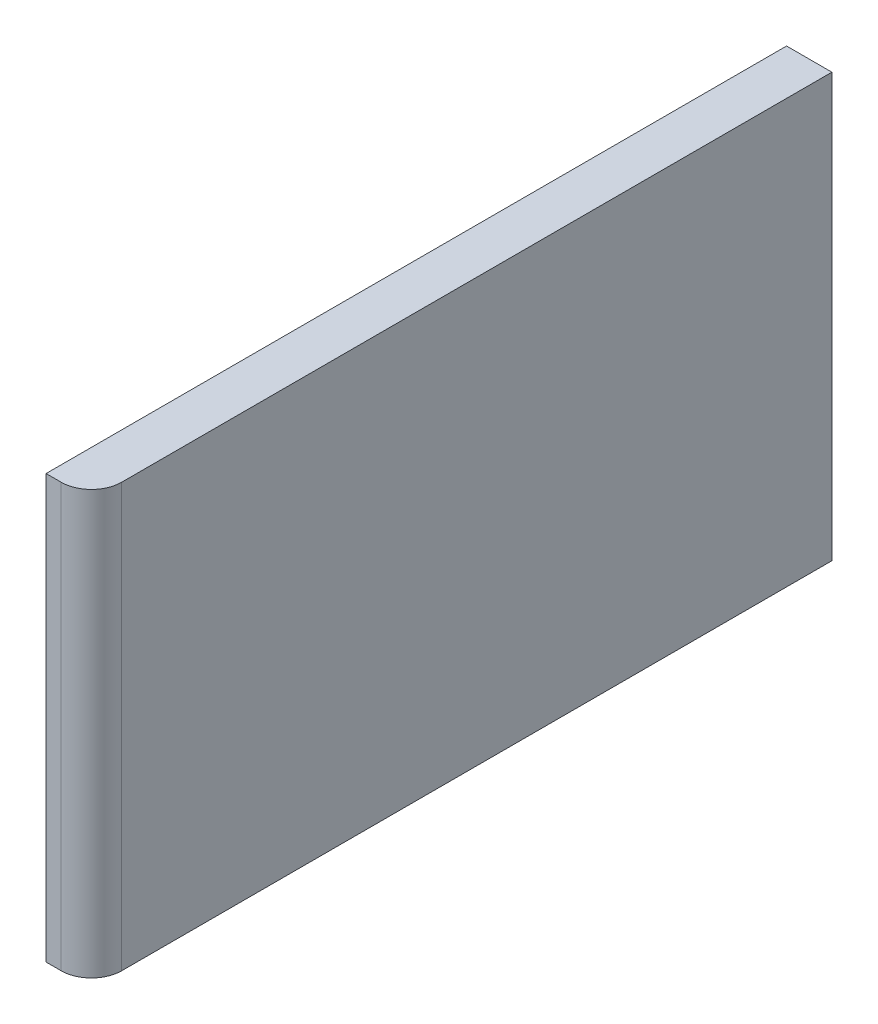
ISO-10303-21;
HEADER;
FILE_DESCRIPTION(('STEP AP214'),'2;1');
FILE_NAME('part.step','',(''),(''),'','','');
FILE_SCHEMA(('AUTOMOTIVE_DESIGN { 1 0 10303 214 1 1 1 1 }'));
ENDSEC;
DATA;
#1=APPLICATION_CONTEXT('core data for automotive mechanical design processes');
#2=APPLICATION_PROTOCOL_DEFINITION('international standard','automotive_design',2000,#1);
#3=PRODUCT_CONTEXT('',#1,'mechanical');
#4=PRODUCT('Part','Part','',(#3));
#5=PRODUCT_RELATED_PRODUCT_CATEGORY('part','',(#4));
#6=PRODUCT_DEFINITION_FORMATION('','',#4);
#7=PRODUCT_DEFINITION_CONTEXT('part definition',#1,'design');
#8=PRODUCT_DEFINITION('design','',#6,#7);
#9=PRODUCT_DEFINITION_SHAPE('','',#8);
#10=(LENGTH_UNIT() NAMED_UNIT(*) SI_UNIT(.MILLI.,.METRE.));
#11=(NAMED_UNIT(*) PLANE_ANGLE_UNIT() SI_UNIT($,.RADIAN.));
#12=(NAMED_UNIT(*) SI_UNIT($,.STERADIAN.) SOLID_ANGLE_UNIT());
#13=UNCERTAINTY_MEASURE_WITH_UNIT(LENGTH_MEASURE(1.E-05),#10,'distance_accuracy_value','');
#14=(GEOMETRIC_REPRESENTATION_CONTEXT(3) GLOBAL_UNCERTAINTY_ASSIGNED_CONTEXT((#13)) GLOBAL_UNIT_ASSIGNED_CONTEXT((#10,
#11,#12)) REPRESENTATION_CONTEXT('',''));
#15=CARTESIAN_POINT('',(0.,0.,0.));
#16=DIRECTION('',(0.,0.,1.));
#17=DIRECTION('',(1.,0.,0.));
#18=AXIS2_PLACEMENT_3D('',#15,#16,#17);
#19=CARTESIAN_POINT('',(10.3,-1.4,0.3));
#20=DIRECTION('',(1.,0.,0.));
#21=DIRECTION('',(0.,0.,-1.));
#22=AXIS2_PLACEMENT_3D('',#19,#20,#21);
#23=PLANE('',#22);
#24=DIRECTION('',(0.,0.,1.));
#25=VECTOR('',#24,1.);
#26=CARTESIAN_POINT('',(10.3,1.4,0.3));
#27=LINE('',#26,#25);
#28=CARTESIAN_POINT('',(10.3,1.4,5.));
#29=VERTEX_POINT('',#28);
#30=CARTESIAN_POINT('',(10.3,1.4,0.3));
#31=VERTEX_POINT('',#30);
#32=EDGE_CURVE('E125',#29,#31,#27,.F.);
#33=ORIENTED_EDGE('',*,*,#32,.F.);
#34=DIRECTION('',(0.,1.,0.));
#35=VECTOR('',#34,1.);
#36=CARTESIAN_POINT('',(10.3,-1.4,5.));
#37=LINE('',#36,#35);
#38=CARTESIAN_POINT('',(10.3,-1.4,5.));
#39=VERTEX_POINT('',#38);
#40=EDGE_CURVE('E119',#39,#29,#37,.T.);
#41=ORIENTED_EDGE('',*,*,#40,.F.);
#42=DIRECTION('',(0.,0.,1.));
#43=VECTOR('',#42,1.);
#44=CARTESIAN_POINT('',(10.3,-1.4,0.3));
#45=LINE('',#44,#43);
#46=CARTESIAN_POINT('',(10.3,-1.4,0.3));
#47=VERTEX_POINT('',#46);
#48=EDGE_CURVE('E121',#39,#47,#45,.F.);
#49=ORIENTED_EDGE('',*,*,#48,.T.);
#50=DIRECTION('',(0.,1.,0.));
#51=VECTOR('',#50,1.);
#52=CARTESIAN_POINT('',(10.3,-1.4,0.3));
#53=LINE('',#52,#51);
#54=EDGE_CURVE('E122',#47,#31,#53,.T.);
#55=ORIENTED_EDGE('',*,*,#54,.T.);
#56=EDGE_LOOP('',(#33,#41,#49,#55));
#57=FACE_BOUND('',#56,.T.);
#58=ADVANCED_FACE('F16',(#57),#23,.T.);
#59=CARTESIAN_POINT('',(10.1,-1.4,5.));
#60=DIRECTION('',(0.,1.,0.));
#61=DIRECTION('',(0.,0.,1.));
#62=AXIS2_PLACEMENT_3D('',#59,#60,#61);
#63=CYLINDRICAL_SURFACE('',#62,0.2);
#64=DIRECTION('',(0.,1.,0.));
#65=VECTOR('',#64,1.);
#66=CARTESIAN_POINT('',(10.1,-1.4,5.2));
#67=LINE('',#66,#65);
#68=CARTESIAN_POINT('',(10.1,-1.4,5.2));
#69=VERTEX_POINT('',#68);
#70=CARTESIAN_POINT('',(10.1,1.4,5.2));
#71=VERTEX_POINT('',#70);
#72=EDGE_CURVE('E72',#69,#71,#67,.T.);
#73=ORIENTED_EDGE('',*,*,#72,.F.);
#74=CARTESIAN_POINT('',(10.1,-1.4,5.));
#75=DIRECTION('',(0.,1.,0.));
#76=DIRECTION('',(0.,0.,1.));
#77=AXIS2_PLACEMENT_3D('',#74,#75,#76);
#78=CIRCLE('',#77,0.2);
#79=EDGE_CURVE('E19',#69,#39,#78,.T.);
#80=ORIENTED_EDGE('',*,*,#79,.T.);
#81=ORIENTED_EDGE('',*,*,#40,.T.);
#82=CARTESIAN_POINT('',(10.1,1.4,5.));
#83=DIRECTION('',(0.,1.,0.));
#84=DIRECTION('',(0.,0.,1.));
#85=AXIS2_PLACEMENT_3D('',#82,#83,#84);
#86=CIRCLE('',#85,0.2);
#87=EDGE_CURVE('E104',#71,#29,#86,.T.);
#88=ORIENTED_EDGE('',*,*,#87,.F.);
#89=EDGE_LOOP('',(#73,#80,#81,#88));
#90=FACE_BOUND('',#89,.T.);
#91=ADVANCED_FACE('F96',(#90),#63,.T.);
#92=CARTESIAN_POINT('',(10.,-1.4,0.3));
#93=DIRECTION('',(0.,1.,0.));
#94=DIRECTION('',(0.,0.,1.));
#95=AXIS2_PLACEMENT_3D('',#92,#93,#94);
#96=PLANE('',#95);
#97=DIRECTION('',(1.,0.,0.));
#98=VECTOR('',#97,1.);
#99=CARTESIAN_POINT('',(10.,-1.4,5.2));
#100=LINE('',#99,#98);
#101=CARTESIAN_POINT('',(10.,-1.4,5.2));
#102=VERTEX_POINT('',#101);
#103=EDGE_CURVE('E74',#102,#69,#100,.T.);
#104=ORIENTED_EDGE('',*,*,#103,.F.);
#105=DIRECTION('',(0.,0.,-1.));
#106=VECTOR('',#105,1.);
#107=CARTESIAN_POINT('',(10.,-1.4,0.3));
#108=LINE('',#107,#106);
#109=CARTESIAN_POINT('',(10.,-1.4,0.3));
#110=VERTEX_POINT('',#109);
#111=EDGE_CURVE('E65',#102,#110,#108,.T.);
#112=ORIENTED_EDGE('',*,*,#111,.T.);
#113=DIRECTION('',(1.,0.,0.));
#114=VECTOR('',#113,1.);
#115=CARTESIAN_POINT('',(10.,-1.4,0.3));
#116=LINE('',#115,#114);
#117=EDGE_CURVE('E126',#110,#47,#116,.T.);
#118=ORIENTED_EDGE('',*,*,#117,.T.);
#119=ORIENTED_EDGE('',*,*,#48,.F.);
#120=ORIENTED_EDGE('',*,*,#79,.F.);
#121=EDGE_LOOP('',(#104,#112,#118,#119,#120));
#122=FACE_BOUND('',#121,.T.);
#123=ADVANCED_FACE('F75',(#122),#96,.F.);
#124=CARTESIAN_POINT('',(10.,-1.4,0.3));
#125=DIRECTION('',(0.,0.,1.));
#126=DIRECTION('',(1.,0.,0.));
#127=AXIS2_PLACEMENT_3D('',#124,#125,#126);
#128=PLANE('',#127);
#129=ORIENTED_EDGE('',*,*,#54,.F.);
#130=ORIENTED_EDGE('',*,*,#117,.F.);
#131=DIRECTION('',(0.,1.,0.));
#132=VECTOR('',#131,1.);
#133=CARTESIAN_POINT('',(10.,-1.4,0.3));
#134=LINE('',#133,#132);
#135=CARTESIAN_POINT('',(10.,1.4,0.3));
#136=VERTEX_POINT('',#135);
#137=EDGE_CURVE('E70',#110,#136,#134,.T.);
#138=ORIENTED_EDGE('',*,*,#137,.T.);
#139=DIRECTION('',(1.,0.,0.));
#140=VECTOR('',#139,1.);
#141=CARTESIAN_POINT('',(10.,1.4,0.3));
#142=LINE('',#141,#140);
#143=EDGE_CURVE('E129',#31,#136,#142,.F.);
#144=ORIENTED_EDGE('',*,*,#143,.F.);
#145=EDGE_LOOP('',(#129,#130,#138,#144));
#146=FACE_BOUND('',#145,.T.);
#147=ADVANCED_FACE('F88',(#146),#128,.F.);
#148=CARTESIAN_POINT('',(10.,1.4,0.3));
#149=DIRECTION('',(0.,1.,0.));
#150=DIRECTION('',(0.,0.,1.));
#151=AXIS2_PLACEMENT_3D('',#148,#149,#150);
#152=PLANE('',#151);
#153=DIRECTION('',(1.,0.,0.));
#154=VECTOR('',#153,1.);
#155=CARTESIAN_POINT('',(10.,1.4,5.2));
#156=LINE('',#155,#154);
#157=CARTESIAN_POINT('',(10.,1.4,5.2));
#158=VERTEX_POINT('',#157);
#159=EDGE_CURVE('E33',#71,#158,#156,.F.);
#160=ORIENTED_EDGE('',*,*,#159,.F.);
#161=ORIENTED_EDGE('',*,*,#87,.T.);
#162=ORIENTED_EDGE('',*,*,#32,.T.);
#163=ORIENTED_EDGE('',*,*,#143,.T.);
#164=DIRECTION('',(0.,0.,-1.));
#165=VECTOR('',#164,1.);
#166=CARTESIAN_POINT('',(10.,1.4,0.3));
#167=LINE('',#166,#165);
#168=EDGE_CURVE('E25',#136,#158,#167,.F.);
#169=ORIENTED_EDGE('',*,*,#168,.T.);
#170=EDGE_LOOP('',(#160,#161,#162,#163,#169));
#171=FACE_BOUND('',#170,.T.);
#172=ADVANCED_FACE('F80',(#171),#152,.T.);
#173=CARTESIAN_POINT('',(10.,-1.4,5.2));
#174=DIRECTION('',(0.,0.,1.));
#175=DIRECTION('',(1.,0.,0.));
#176=AXIS2_PLACEMENT_3D('',#173,#174,#175);
#177=PLANE('',#176);
#178=ORIENTED_EDGE('',*,*,#103,.T.);
#179=ORIENTED_EDGE('',*,*,#72,.T.);
#180=ORIENTED_EDGE('',*,*,#159,.T.);
#181=DIRECTION('',(0.,1.,0.));
#182=VECTOR('',#181,1.);
#183=CARTESIAN_POINT('',(10.,-1.4,5.2));
#184=LINE('',#183,#182);
#185=EDGE_CURVE('E10',#158,#102,#184,.F.);
#186=ORIENTED_EDGE('',*,*,#185,.T.);
#187=EDGE_LOOP('',(#178,#179,#180,#186));
#188=FACE_BOUND('',#187,.T.);
#189=ADVANCED_FACE('F78',(#188),#177,.T.);
#190=CARTESIAN_POINT('',(10.,-1.4,0.3));
#191=DIRECTION('',(1.,0.,0.));
#192=DIRECTION('',(0.,0.,-1.));
#193=AXIS2_PLACEMENT_3D('',#190,#191,#192);
#194=PLANE('',#193);
#195=ORIENTED_EDGE('',*,*,#168,.F.);
#196=ORIENTED_EDGE('',*,*,#137,.F.);
#197=ORIENTED_EDGE('',*,*,#111,.F.);
#198=ORIENTED_EDGE('',*,*,#185,.F.);
#199=EDGE_LOOP('',(#195,#196,#197,#198));
#200=FACE_BOUND('',#199,.T.);
#201=ADVANCED_FACE('F67',(#200),#194,.F.);
#202=CLOSED_SHELL('',(#58,#91,#123,#147,#172,#189,#201));
#203=MANIFOLD_SOLID_BREP('B1',#202);
#204=ADVANCED_BREP_SHAPE_REPRESENTATION('',(#18,#203),#14);
#205=SHAPE_DEFINITION_REPRESENTATION(#9,#204);
ENDSEC;
END-ISO-10303-21;
